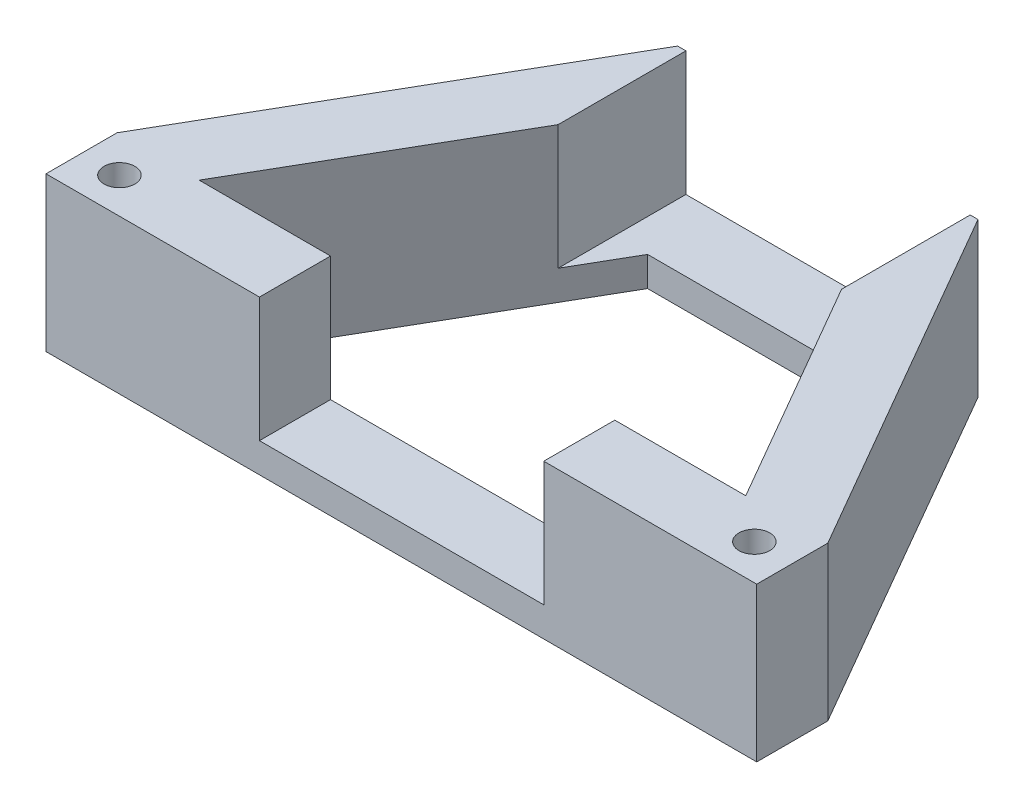
ISO-10303-21;
HEADER;
FILE_DESCRIPTION(('STEP AP214'),'2;1');
FILE_NAME('part.step','',(''),(''),'','','');
FILE_SCHEMA(('AUTOMOTIVE_DESIGN { 1 0 10303 214 1 1 1 1 }'));
ENDSEC;
DATA;
#1=APPLICATION_CONTEXT('core data for automotive mechanical design processes');
#2=APPLICATION_PROTOCOL_DEFINITION('international standard','automotive_design',2000,#1);
#3=PRODUCT_CONTEXT('',#1,'mechanical');
#4=PRODUCT('Part','Part','',(#3));
#5=PRODUCT_RELATED_PRODUCT_CATEGORY('part','',(#4));
#6=PRODUCT_DEFINITION_FORMATION('','',#4);
#7=PRODUCT_DEFINITION_CONTEXT('part definition',#1,'design');
#8=PRODUCT_DEFINITION('design','',#6,#7);
#9=PRODUCT_DEFINITION_SHAPE('','',#8);
#10=(LENGTH_UNIT() NAMED_UNIT(*) SI_UNIT(.MILLI.,.METRE.));
#11=(NAMED_UNIT(*) PLANE_ANGLE_UNIT() SI_UNIT($,.RADIAN.));
#12=(NAMED_UNIT(*) SI_UNIT($,.STERADIAN.) SOLID_ANGLE_UNIT());
#13=UNCERTAINTY_MEASURE_WITH_UNIT(LENGTH_MEASURE(1.E-05),#10,'distance_accuracy_value','');
#14=(GEOMETRIC_REPRESENTATION_CONTEXT(3) GLOBAL_UNCERTAINTY_ASSIGNED_CONTEXT((#13)) GLOBAL_UNIT_ASSIGNED_CONTEXT((#10,
#11,#12)) REPRESENTATION_CONTEXT('',''));
#15=CARTESIAN_POINT('',(0.,0.,0.));
#16=DIRECTION('',(0.,0.,1.));
#17=DIRECTION('',(1.,0.,0.));
#18=AXIS2_PLACEMENT_3D('',#15,#16,#17);
#19=CARTESIAN_POINT('',(0.,16.51,0.));
#20=DIRECTION('',(0.,1.,0.));
#21=DIRECTION('',(0.,0.,1.));
#22=AXIS2_PLACEMENT_3D('',#19,#20,#21);
#23=PLANE('',#22);
#24=DIRECTION('',(0.,0.,1.));
#25=VECTOR('',#24,1.);
#26=CARTESIAN_POINT('',(-3.88055357758678,16.51,-30.6106058641939));
#27=LINE('',#26,#25);
#28=CARTESIAN_POINT('',(-3.88055357758678,16.51,-30.6106058641939));
#29=VERTEX_POINT('',#28);
#30=CARTESIAN_POINT('',(-3.88055357758678,16.51,-16.9103990321226));
#31=VERTEX_POINT('',#30);
#32=EDGE_CURVE('E195',#29,#31,#27,.T.);
#33=ORIENTED_EDGE('',*,*,#32,.F.);
#34=DIRECTION('',(-1.,0.,0.));
#35=VECTOR('',#34,1.);
#36=CARTESIAN_POINT('',(-4.76955357758678,16.51,-30.6106058641939));
#37=LINE('',#36,#35);
#38=CARTESIAN_POINT('',(-4.76955357758678,16.51,-30.6106058641939));
#39=VERTEX_POINT('',#38);
#40=EDGE_CURVE('E268',#29,#39,#37,.T.);
#41=ORIENTED_EDGE('',*,*,#40,.T.);
#42=DIRECTION('',(-0.499999999999998,0.,0.86602540378444));
#43=VECTOR('',#42,1.);
#44=CARTESIAN_POINT('',(-26.7665988337114,16.51,7.48939413580611));
#45=LINE('',#44,#43);
#46=CARTESIAN_POINT('',(-26.7665988337114,16.51,7.48939413580611));
#47=VERTEX_POINT('',#46);
#48=EDGE_CURVE('E272',#39,#47,#45,.T.);
#49=ORIENTED_EDGE('',*,*,#48,.T.);
#50=DIRECTION('',(0.,0.,1.));
#51=VECTOR('',#50,1.);
#52=CARTESIAN_POINT('',(-26.7665988337114,16.51,7.48939413580611));
#53=LINE('',#52,#51);
#54=CARTESIAN_POINT('',(-26.7665988337114,16.51,15.1093941358061));
#55=VERTEX_POINT('',#54);
#56=EDGE_CURVE('E257',#47,#55,#53,.T.);
#57=ORIENTED_EDGE('',*,*,#56,.T.);
#58=DIRECTION('',(1.,0.,0.));
#59=VECTOR('',#58,1.);
#60=CARTESIAN_POINT('',(-26.7665988337114,16.51,15.1093941358061));
#61=LINE('',#60,#59);
#62=CARTESIAN_POINT('',(-3.88055357758678,16.51,15.1093941358061));
#63=VERTEX_POINT('',#62);
#64=EDGE_CURVE('E262',#55,#63,#61,.T.);
#65=ORIENTED_EDGE('',*,*,#64,.T.);
#66=CARTESIAN_POINT('',(-3.88055357758678,16.51,7.48939413580611));
#67=VERTEX_POINT('',#66);
#68=EDGE_CURVE('E181',#67,#63,#27,.T.);
#69=ORIENTED_EDGE('',*,*,#68,.F.);
#70=DIRECTION('',(1.,0.,0.));
#71=VECTOR('',#70,1.);
#72=CARTESIAN_POINT('',(-17.9677807312615,16.51,7.48939413580611));
#73=LINE('',#72,#71);
#74=CARTESIAN_POINT('',(-17.9677807312615,16.51,7.48939413580611));
#75=VERTEX_POINT('',#74);
#76=EDGE_CURVE('E231',#75,#67,#73,.T.);
#77=ORIENTED_EDGE('',*,*,#76,.F.);
#78=DIRECTION('',(-0.499999999999998,0.,0.86602540378444));
#79=VECTOR('',#78,1.);
#80=CARTESIAN_POINT('',(-17.9677807312615,16.51,7.48939413580611));
#81=LINE('',#80,#79);
#82=EDGE_CURVE('E227',#31,#75,#81,.T.);
#83=ORIENTED_EDGE('',*,*,#82,.F.);
#84=EDGE_LOOP('',(#33,#41,#49,#57,#65,#69,#77,#83));
#85=FACE_BOUND('',#84,.T.);
#86=CARTESIAN_POINT('',(-22.7025988337114,16.51,11.2993941358061));
#87=DIRECTION('',(0.,1.,0.));
#88=DIRECTION('',(0.,0.,1.));
#89=AXIS2_PLACEMENT_3D('',#86,#87,#88);
#90=CIRCLE('',#89,1.651);
#91=CARTESIAN_POINT('',(-22.7025988337114,16.51,12.9503941358061));
#92=VERTEX_POINT('',#91);
#93=EDGE_CURVE('E219',#92,#92,#90,.T.);
#94=ORIENTED_EDGE('',*,*,#93,.F.);
#95=EDGE_LOOP('',(#94));
#96=FACE_BOUND('',#95,.T.);
#97=ADVANCED_FACE('F41',(#85,#96),#23,.T.);
#98=CARTESIAN_POINT('',(-0.370144526361818,16.51,-22.9906058641939));
#99=DIRECTION('',(0.,0.,1.));
#100=DIRECTION('',(1.,0.,0.));
#101=AXIS2_PLACEMENT_3D('',#98,#99,#100);
#102=PLANE('',#101);
#103=DIRECTION('',(0.,-1.,0.));
#104=VECTOR('',#103,1.);
#105=CARTESIAN_POINT('',(23.036946858939,16.51,-22.9906058641939));
#106=LINE('',#105,#104);
#107=CARTESIAN_POINT('',(23.036946858939,3.175,-22.9906058641939));
#108=VERTEX_POINT('',#107);
#109=CARTESIAN_POINT('',(23.036946858939,0.,-22.9906058641939));
#110=VERTEX_POINT('',#109);
#111=EDGE_CURVE('E249',#108,#110,#106,.T.);
#112=ORIENTED_EDGE('',*,*,#111,.F.);
#113=DIRECTION('',(-1.,0.,0.));
#114=VECTOR('',#113,1.);
#115=CARTESIAN_POINT('',(-0.370144526361818,3.175,-22.9906058641939));
#116=LINE('',#115,#114);
#117=CARTESIAN_POINT('',(-0.370144526361818,3.175,-22.9906058641939));
#118=VERTEX_POINT('',#117);
#119=EDGE_CURVE('E303',#108,#118,#116,.T.);
#120=ORIENTED_EDGE('',*,*,#119,.T.);
#121=DIRECTION('',(0.,-1.,0.));
#122=VECTOR('',#121,1.);
#123=CARTESIAN_POINT('',(-0.370144526361818,16.51,-22.9906058641939));
#124=LINE('',#123,#122);
#125=CARTESIAN_POINT('',(-0.370144526361818,0.,-22.9906058641939));
#126=VERTEX_POINT('',#125);
#127=EDGE_CURVE('E237',#118,#126,#124,.T.);
#128=ORIENTED_EDGE('',*,*,#127,.T.);
#129=DIRECTION('',(-1.,0.,0.));
#130=VECTOR('',#129,1.);
#131=CARTESIAN_POINT('',(-0.370144526361818,0.,-22.9906058641939));
#132=LINE('',#131,#130);
#133=EDGE_CURVE('E230',#110,#126,#132,.T.);
#134=ORIENTED_EDGE('',*,*,#133,.F.);
#135=EDGE_LOOP('',(#112,#120,#128,#134));
#136=FACE_BOUND('',#135,.T.);
#137=ADVANCED_FACE('F347',(#136),#102,.T.);
#138=DIRECTION('',(0.,0.,-1.));
#139=VECTOR('',#138,1.);
#140=CARTESIAN_POINT('',(26.5994464224132,16.51,-30.6106058641939));
#141=LINE('',#140,#139);
#142=CARTESIAN_POINT('',(26.5994464224132,16.51,15.1093941358061));
#143=VERTEX_POINT('',#142);
#144=CARTESIAN_POINT('',(26.5994464224132,16.51,7.48939413580611));
#145=VERTEX_POINT('',#144);
#146=EDGE_CURVE('E175',#143,#145,#141,.T.);
#147=ORIENTED_EDGE('',*,*,#146,.F.);
#148=CARTESIAN_POINT('',(49.4334011662886,16.51,15.1093941358061));
#149=VERTEX_POINT('',#148);
#150=EDGE_CURVE('E260',#143,#149,#61,.T.);
#151=ORIENTED_EDGE('',*,*,#150,.T.);
#152=DIRECTION('',(0.,0.,-1.));
#153=VECTOR('',#152,1.);
#154=CARTESIAN_POINT('',(49.4334011662887,16.51,7.489394135806));
#155=LINE('',#154,#153);
#156=CARTESIAN_POINT('',(49.4334011662887,16.51,7.489394135806));
#157=VERTEX_POINT('',#156);
#158=EDGE_CURVE('E264',#149,#157,#155,.T.);
#159=ORIENTED_EDGE('',*,*,#158,.T.);
#160=DIRECTION('',(-0.5,0.,-0.866025403784439));
#161=VECTOR('',#160,1.);
#162=CARTESIAN_POINT('',(27.436355910164,16.51,-30.6106058641939));
#163=LINE('',#162,#161);
#164=CARTESIAN_POINT('',(27.436355910164,16.51,-30.6106058641939));
#165=VERTEX_POINT('',#164);
#166=EDGE_CURVE('E266',#157,#165,#163,.T.);
#167=ORIENTED_EDGE('',*,*,#166,.T.);
#168=CARTESIAN_POINT('',(26.5994464224132,16.51,-30.6106058641939));
#169=VERTEX_POINT('',#168);
#170=EDGE_CURVE('E269',#165,#169,#37,.T.);
#171=ORIENTED_EDGE('',*,*,#170,.T.);
#172=CARTESIAN_POINT('',(26.5994464224132,16.51,-16.8201756183146));
#173=VERTEX_POINT('',#172);
#174=EDGE_CURVE('E197',#173,#169,#141,.T.);
#175=ORIENTED_EDGE('',*,*,#174,.F.);
#176=DIRECTION('',(-0.499999999999998,0.,-0.86602540378444));
#177=VECTOR('',#176,1.);
#178=CARTESIAN_POINT('',(23.036946858939,16.51,-22.9906058641939));
#179=LINE('',#178,#177);
#180=CARTESIAN_POINT('',(40.6345830638387,16.51,7.48939413580611));
#181=VERTEX_POINT('',#180);
#182=EDGE_CURVE('E234',#181,#173,#179,.T.);
#183=ORIENTED_EDGE('',*,*,#182,.F.);
#184=EDGE_CURVE('E229',#145,#181,#73,.T.);
#185=ORIENTED_EDGE('',*,*,#184,.F.);
#186=EDGE_LOOP('',(#147,#151,#159,#167,#171,#175,#183,#185));
#187=FACE_BOUND('',#186,.T.);
#188=CARTESIAN_POINT('',(45.3694011662886,16.51,11.2993941358061));
#189=DIRECTION('',(0.,1.,0.));
#190=DIRECTION('',(0.,0.,1.));
#191=AXIS2_PLACEMENT_3D('',#188,#189,#190);
#192=CIRCLE('',#191,1.651);
#193=CARTESIAN_POINT('',(45.3694011662886,16.51,12.9503941358061));
#194=VERTEX_POINT('',#193);
#195=EDGE_CURVE('E222',#194,#194,#192,.T.);
#196=ORIENTED_EDGE('',*,*,#195,.F.);
#197=EDGE_LOOP('',(#196));
#198=FACE_BOUND('',#197,.T.);
#199=ADVANCED_FACE('F314',(#187,#198),#23,.T.);
#200=CARTESIAN_POINT('',(0.,0.,0.));
#201=DIRECTION('',(0.,1.,0.));
#202=DIRECTION('',(0.,0.,1.));
#203=AXIS2_PLACEMENT_3D('',#200,#201,#202);
#204=PLANE('',#203);
#205=CARTESIAN_POINT('',(-22.7025988337114,0.,11.2993941358061));
#206=DIRECTION('',(0.,1.,0.));
#207=DIRECTION('',(0.,0.,1.));
#208=AXIS2_PLACEMENT_3D('',#205,#206,#207);
#209=CIRCLE('',#208,1.651);
#210=CARTESIAN_POINT('',(-22.7025988337114,0.,12.9503941358061));
#211=VERTEX_POINT('',#210);
#212=EDGE_CURVE('E215',#211,#211,#209,.T.);
#213=ORIENTED_EDGE('',*,*,#212,.T.);
#214=EDGE_LOOP('',(#213));
#215=FACE_BOUND('',#214,.T.);
#216=CARTESIAN_POINT('',(45.3694011662886,0.,11.2993941358061));
#217=DIRECTION('',(0.,1.,0.));
#218=DIRECTION('',(0.,0.,1.));
#219=AXIS2_PLACEMENT_3D('',#216,#217,#218);
#220=CIRCLE('',#219,1.651);
#221=CARTESIAN_POINT('',(45.3694011662886,0.,12.9503941358061));
#222=VERTEX_POINT('',#221);
#223=EDGE_CURVE('E214',#222,#222,#220,.T.);
#224=ORIENTED_EDGE('',*,*,#223,.T.);
#225=EDGE_LOOP('',(#224));
#226=FACE_BOUND('',#225,.T.);
#227=DIRECTION('',(0.,0.,1.));
#228=VECTOR('',#227,1.);
#229=CARTESIAN_POINT('',(-26.7665988337114,0.,7.48939413580611));
#230=LINE('',#229,#228);
#231=CARTESIAN_POINT('',(-26.7665988337114,0.,7.48939413580611));
#232=VERTEX_POINT('',#231);
#233=CARTESIAN_POINT('',(-26.7665988337114,0.,15.1093941358061));
#234=VERTEX_POINT('',#233);
#235=EDGE_CURVE('E256',#232,#234,#230,.T.);
#236=ORIENTED_EDGE('',*,*,#235,.F.);
#237=DIRECTION('',(-0.499999999999998,0.,0.86602540378444));
#238=VECTOR('',#237,1.);
#239=CARTESIAN_POINT('',(-26.7665988337114,0.,7.48939413580611));
#240=LINE('',#239,#238);
#241=CARTESIAN_POINT('',(-4.76955357758678,0.,-30.6106058641939));
#242=VERTEX_POINT('',#241);
#243=EDGE_CURVE('E261',#242,#232,#240,.T.);
#244=ORIENTED_EDGE('',*,*,#243,.F.);
#245=DIRECTION('',(-1.,0.,0.));
#246=VECTOR('',#245,1.);
#247=CARTESIAN_POINT('',(-4.76955357758678,0.,-30.6106058641939));
#248=LINE('',#247,#246);
#249=CARTESIAN_POINT('',(27.436355910164,0.,-30.6106058641939));
#250=VERTEX_POINT('',#249);
#251=EDGE_CURVE('E283',#250,#242,#248,.T.);
#252=ORIENTED_EDGE('',*,*,#251,.F.);
#253=DIRECTION('',(-0.5,0.,-0.866025403784439));
#254=VECTOR('',#253,1.);
#255=CARTESIAN_POINT('',(27.436355910164,0.,-30.6106058641939));
#256=LINE('',#255,#254);
#257=CARTESIAN_POINT('',(49.4334011662887,0.,7.489394135806));
#258=VERTEX_POINT('',#257);
#259=EDGE_CURVE('E281',#258,#250,#256,.T.);
#260=ORIENTED_EDGE('',*,*,#259,.F.);
#261=DIRECTION('',(0.,0.,-1.));
#262=VECTOR('',#261,1.);
#263=CARTESIAN_POINT('',(49.4334011662887,0.,7.489394135806));
#264=LINE('',#263,#262);
#265=CARTESIAN_POINT('',(49.4334011662886,0.,15.1093941358061));
#266=VERTEX_POINT('',#265);
#267=EDGE_CURVE('E279',#266,#258,#264,.T.);
#268=ORIENTED_EDGE('',*,*,#267,.F.);
#269=DIRECTION('',(1.,0.,0.));
#270=VECTOR('',#269,1.);
#271=CARTESIAN_POINT('',(-26.7665988337114,0.,15.1093941358061));
#272=LINE('',#271,#270);
#273=EDGE_CURVE('E277',#234,#266,#272,.T.);
#274=ORIENTED_EDGE('',*,*,#273,.F.);
#275=EDGE_LOOP('',(#236,#244,#252,#260,#268,#274));
#276=FACE_BOUND('',#275,.T.);
#277=DIRECTION('',(-0.499999999999998,0.,0.86602540378444));
#278=VECTOR('',#277,1.);
#279=CARTESIAN_POINT('',(-17.9677807312615,0.,7.48939413580611));
#280=LINE('',#279,#278);
#281=CARTESIAN_POINT('',(-17.9677807312615,0.,7.48939413580611));
#282=VERTEX_POINT('',#281);
#283=EDGE_CURVE('E218',#126,#282,#280,.T.);
#284=ORIENTED_EDGE('',*,*,#283,.T.);
#285=DIRECTION('',(1.,0.,0.));
#286=VECTOR('',#285,1.);
#287=CARTESIAN_POINT('',(-17.9677807312615,0.,7.48939413580611));
#288=LINE('',#287,#286);
#289=CARTESIAN_POINT('',(40.6345830638387,0.,7.48939413580611));
#290=VERTEX_POINT('',#289);
#291=EDGE_CURVE('E240',#282,#290,#288,.T.);
#292=ORIENTED_EDGE('',*,*,#291,.T.);
#293=DIRECTION('',(-0.499999999999998,0.,-0.86602540378444));
#294=VECTOR('',#293,1.);
#295=CARTESIAN_POINT('',(23.036946858939,0.,-22.9906058641939));
#296=LINE('',#295,#294);
#297=EDGE_CURVE('E243',#290,#110,#296,.T.);
#298=ORIENTED_EDGE('',*,*,#297,.T.);
#299=ORIENTED_EDGE('',*,*,#133,.T.);
#300=EDGE_LOOP('',(#284,#292,#298,#299));
#301=FACE_BOUND('',#300,.T.);
#302=ADVANCED_FACE('F351',(#215,#226,#276,#301),#204,.F.);
#303=CARTESIAN_POINT('',(-26.7665988337114,16.51,7.48939413580611));
#304=DIRECTION('',(1.,0.,0.));
#305=DIRECTION('',(0.,0.,-1.));
#306=AXIS2_PLACEMENT_3D('',#303,#304,#305);
#307=PLANE('',#306);
#308=ORIENTED_EDGE('',*,*,#235,.T.);
#309=DIRECTION('',(0.,-1.,0.));
#310=VECTOR('',#309,1.);
#311=CARTESIAN_POINT('',(-26.7665988337114,16.51,15.1093941358061));
#312=LINE('',#311,#310);
#313=EDGE_CURVE('E300',#55,#234,#312,.T.);
#314=ORIENTED_EDGE('',*,*,#313,.F.);
#315=ORIENTED_EDGE('',*,*,#56,.F.);
#316=DIRECTION('',(0.,-1.,0.));
#317=VECTOR('',#316,1.);
#318=CARTESIAN_POINT('',(-26.7665988337114,16.51,7.48939413580611));
#319=LINE('',#318,#317);
#320=EDGE_CURVE('E274',#47,#232,#319,.T.);
#321=ORIENTED_EDGE('',*,*,#320,.T.);
#322=EDGE_LOOP('',(#308,#314,#315,#321));
#323=FACE_BOUND('',#322,.T.);
#324=ADVANCED_FACE('F43',(#323),#307,.F.);
#325=CARTESIAN_POINT('',(-26.7665988337114,16.51,15.1093941358061));
#326=DIRECTION('',(0.,0.,-1.));
#327=DIRECTION('',(-1.,0.,0.));
#328=AXIS2_PLACEMENT_3D('',#325,#326,#327);
#329=PLANE('',#328);
#330=DIRECTION('',(1.,0.,0.));
#331=VECTOR('',#330,1.);
#332=CARTESIAN_POINT('',(-3.88055357758678,3.175,15.1093941358061));
#333=LINE('',#332,#331);
#334=CARTESIAN_POINT('',(-3.88055357758678,3.175,15.1093941358061));
#335=VERTEX_POINT('',#334);
#336=CARTESIAN_POINT('',(26.5994464224132,3.175,15.1093941358061));
#337=VERTEX_POINT('',#336);
#338=EDGE_CURVE('E168',#335,#337,#333,.T.);
#339=ORIENTED_EDGE('',*,*,#338,.F.);
#340=DIRECTION('',(0.,1.,0.));
#341=VECTOR('',#340,1.);
#342=CARTESIAN_POINT('',(-3.88055357758678,3.175,15.1093941358061));
#343=LINE('',#342,#341);
#344=EDGE_CURVE('E178',#335,#63,#343,.T.);
#345=ORIENTED_EDGE('',*,*,#344,.T.);
#346=ORIENTED_EDGE('',*,*,#64,.F.);
#347=ORIENTED_EDGE('',*,*,#313,.T.);
#348=ORIENTED_EDGE('',*,*,#273,.T.);
#349=DIRECTION('',(0.,-1.,0.));
#350=VECTOR('',#349,1.);
#351=CARTESIAN_POINT('',(49.4334011662886,16.51,15.1093941358061));
#352=LINE('',#351,#350);
#353=EDGE_CURVE('E297',#149,#266,#352,.T.);
#354=ORIENTED_EDGE('',*,*,#353,.F.);
#355=ORIENTED_EDGE('',*,*,#150,.F.);
#356=DIRECTION('',(0.,1.,0.));
#357=VECTOR('',#356,1.);
#358=CARTESIAN_POINT('',(26.5994464224132,3.175,15.1093941358061));
#359=LINE('',#358,#357);
#360=EDGE_CURVE('E184',#337,#143,#359,.T.);
#361=ORIENTED_EDGE('',*,*,#360,.F.);
#362=EDGE_LOOP('',(#339,#345,#346,#347,#348,#354,#355,#361));
#363=FACE_BOUND('',#362,.T.);
#364=ADVANCED_FACE('F187',(#363),#329,.F.);
#365=CARTESIAN_POINT('',(49.4334011662887,16.51,7.489394135806));
#366=DIRECTION('',(-1.,0.,0.));
#367=DIRECTION('',(0.,0.,1.));
#368=AXIS2_PLACEMENT_3D('',#365,#366,#367);
#369=PLANE('',#368);
#370=ORIENTED_EDGE('',*,*,#267,.T.);
#371=DIRECTION('',(0.,-1.,0.));
#372=VECTOR('',#371,1.);
#373=CARTESIAN_POINT('',(49.4334011662887,16.51,7.489394135806));
#374=LINE('',#373,#372);
#375=EDGE_CURVE('E294',#157,#258,#374,.T.);
#376=ORIENTED_EDGE('',*,*,#375,.F.);
#377=ORIENTED_EDGE('',*,*,#158,.F.);
#378=ORIENTED_EDGE('',*,*,#353,.T.);
#379=EDGE_LOOP('',(#370,#376,#377,#378));
#380=FACE_BOUND('',#379,.T.);
#381=ADVANCED_FACE('F331',(#380),#369,.F.);
#382=CARTESIAN_POINT('',(27.436355910164,16.51,-30.6106058641939));
#383=DIRECTION('',(-0.866025403784439,0.,0.5));
#384=DIRECTION('',(0.5,0.,0.866025403784439));
#385=AXIS2_PLACEMENT_3D('',#382,#383,#384);
#386=PLANE('',#385);
#387=ORIENTED_EDGE('',*,*,#259,.T.);
#388=DIRECTION('',(0.,-1.,0.));
#389=VECTOR('',#388,1.);
#390=CARTESIAN_POINT('',(27.436355910164,16.51,-30.6106058641939));
#391=LINE('',#390,#389);
#392=EDGE_CURVE('E291',#165,#250,#391,.T.);
#393=ORIENTED_EDGE('',*,*,#392,.F.);
#394=ORIENTED_EDGE('',*,*,#166,.F.);
#395=ORIENTED_EDGE('',*,*,#375,.T.);
#396=EDGE_LOOP('',(#387,#393,#394,#395));
#397=FACE_BOUND('',#396,.T.);
#398=ADVANCED_FACE('F335',(#397),#386,.F.);
#399=CARTESIAN_POINT('',(-4.76955357758678,16.51,-30.6106058641939));
#400=DIRECTION('',(0.,0.,1.));
#401=DIRECTION('',(1.,0.,0.));
#402=AXIS2_PLACEMENT_3D('',#399,#400,#401);
#403=PLANE('',#402);
#404=ORIENTED_EDGE('',*,*,#40,.F.);
#405=DIRECTION('',(0.,1.,0.));
#406=VECTOR('',#405,1.);
#407=CARTESIAN_POINT('',(-3.88055357758678,3.175,-30.6106058641939));
#408=LINE('',#407,#406);
#409=CARTESIAN_POINT('',(-3.88055357758678,3.175,-30.6106058641939));
#410=VERTEX_POINT('',#409);
#411=EDGE_CURVE('E199',#410,#29,#408,.T.);
#412=ORIENTED_EDGE('',*,*,#411,.F.);
#413=DIRECTION('',(-1.,0.,0.));
#414=VECTOR('',#413,1.);
#415=CARTESIAN_POINT('',(-3.88055357758678,3.175,-30.6106058641939));
#416=LINE('',#415,#414);
#417=CARTESIAN_POINT('',(26.5994464224132,3.175,-30.6106058641939));
#418=VERTEX_POINT('',#417);
#419=EDGE_CURVE('E185',#418,#410,#416,.T.);
#420=ORIENTED_EDGE('',*,*,#419,.F.);
#421=DIRECTION('',(0.,1.,0.));
#422=VECTOR('',#421,1.);
#423=CARTESIAN_POINT('',(26.5994464224132,3.175,-30.6106058641939));
#424=LINE('',#423,#422);
#425=EDGE_CURVE('E202',#418,#169,#424,.T.);
#426=ORIENTED_EDGE('',*,*,#425,.T.);
#427=ORIENTED_EDGE('',*,*,#170,.F.);
#428=ORIENTED_EDGE('',*,*,#392,.T.);
#429=ORIENTED_EDGE('',*,*,#251,.T.);
#430=DIRECTION('',(0.,-1.,0.));
#431=VECTOR('',#430,1.);
#432=CARTESIAN_POINT('',(-4.76955357758678,16.51,-30.6106058641939));
#433=LINE('',#432,#431);
#434=EDGE_CURVE('E288',#39,#242,#433,.T.);
#435=ORIENTED_EDGE('',*,*,#434,.F.);
#436=EDGE_LOOP('',(#404,#412,#420,#426,#427,#428,#429,#435));
#437=FACE_BOUND('',#436,.T.);
#438=ADVANCED_FACE('F340',(#437),#403,.F.);
#439=CARTESIAN_POINT('',(-26.7665988337114,16.51,7.48939413580611));
#440=DIRECTION('',(0.86602540378444,0.,0.499999999999998));
#441=DIRECTION('',(0.499999999999998,0.,-0.86602540378444));
#442=AXIS2_PLACEMENT_3D('',#439,#440,#441);
#443=PLANE('',#442);
#444=ORIENTED_EDGE('',*,*,#243,.T.);
#445=ORIENTED_EDGE('',*,*,#320,.F.);
#446=ORIENTED_EDGE('',*,*,#48,.F.);
#447=ORIENTED_EDGE('',*,*,#434,.T.);
#448=EDGE_LOOP('',(#444,#445,#446,#447));
#449=FACE_BOUND('',#448,.T.);
#450=ADVANCED_FACE('F370',(#449),#443,.F.);
#451=CARTESIAN_POINT('',(-17.9677807312615,16.51,7.48939413580611));
#452=DIRECTION('',(0.86602540378444,0.,0.499999999999998));
#453=DIRECTION('',(0.499999999999998,0.,-0.86602540378444));
#454=AXIS2_PLACEMENT_3D('',#451,#452,#453);
#455=PLANE('',#454);
#456=DIRECTION('',(0.,-1.,0.));
#457=VECTOR('',#456,1.);
#458=CARTESIAN_POINT('',(-3.88055357758678,16.51,-16.9103990321226));
#459=LINE('',#458,#457);
#460=CARTESIAN_POINT('',(-3.88055357758678,3.175,-16.9103990321226));
#461=VERTEX_POINT('',#460);
#462=EDGE_CURVE('E212',#31,#461,#459,.T.);
#463=ORIENTED_EDGE('',*,*,#462,.F.);
#464=ORIENTED_EDGE('',*,*,#82,.T.);
#465=DIRECTION('',(0.,-1.,0.));
#466=VECTOR('',#465,1.);
#467=CARTESIAN_POINT('',(-17.9677807312615,16.51,7.48939413580611));
#468=LINE('',#467,#466);
#469=EDGE_CURVE('E253',#75,#282,#468,.T.);
#470=ORIENTED_EDGE('',*,*,#469,.T.);
#471=ORIENTED_EDGE('',*,*,#283,.F.);
#472=ORIENTED_EDGE('',*,*,#127,.F.);
#473=DIRECTION('',(-0.499999999999998,0.,0.86602540378444));
#474=VECTOR('',#473,1.);
#475=CARTESIAN_POINT('',(-17.9677807312615,3.175,7.48939413580611));
#476=LINE('',#475,#474);
#477=EDGE_CURVE('E64',#118,#461,#476,.T.);
#478=ORIENTED_EDGE('',*,*,#477,.T.);
#479=EDGE_LOOP('',(#463,#464,#470,#471,#472,#478));
#480=FACE_BOUND('',#479,.T.);
#481=ADVANCED_FACE('F354',(#480),#455,.T.);
#482=CARTESIAN_POINT('',(-17.9677807312615,16.51,7.48939413580611));
#483=DIRECTION('',(0.,0.,-1.));
#484=DIRECTION('',(-1.,0.,0.));
#485=AXIS2_PLACEMENT_3D('',#482,#483,#484);
#486=PLANE('',#485);
#487=DIRECTION('',(0.,1.,0.));
#488=VECTOR('',#487,1.);
#489=CARTESIAN_POINT('',(-3.88055357758678,16.51,7.48939413580611));
#490=LINE('',#489,#488);
#491=CARTESIAN_POINT('',(-3.88055357758678,3.175,7.48939413580611));
#492=VERTEX_POINT('',#491);
#493=EDGE_CURVE('E11',#492,#67,#490,.T.);
#494=ORIENTED_EDGE('',*,*,#493,.F.);
#495=DIRECTION('',(1.,0.,0.));
#496=VECTOR('',#495,1.);
#497=CARTESIAN_POINT('',(-17.9677807312615,3.175,7.48939413580611));
#498=LINE('',#497,#496);
#499=CARTESIAN_POINT('',(26.5994464224132,3.175,7.48939413580611));
#500=VERTEX_POINT('',#499);
#501=EDGE_CURVE('E171',#492,#500,#498,.T.);
#502=ORIENTED_EDGE('',*,*,#501,.T.);
#503=DIRECTION('',(0.,-1.,0.));
#504=VECTOR('',#503,1.);
#505=CARTESIAN_POINT('',(26.5994464224132,16.51,7.48939413580611));
#506=LINE('',#505,#504);
#507=EDGE_CURVE('E210',#145,#500,#506,.T.);
#508=ORIENTED_EDGE('',*,*,#507,.F.);
#509=ORIENTED_EDGE('',*,*,#184,.T.);
#510=DIRECTION('',(0.,-1.,0.));
#511=VECTOR('',#510,1.);
#512=CARTESIAN_POINT('',(40.6345830638387,16.51,7.48939413580611));
#513=LINE('',#512,#511);
#514=EDGE_CURVE('E251',#181,#290,#513,.T.);
#515=ORIENTED_EDGE('',*,*,#514,.T.);
#516=ORIENTED_EDGE('',*,*,#291,.F.);
#517=ORIENTED_EDGE('',*,*,#469,.F.);
#518=ORIENTED_EDGE('',*,*,#76,.T.);
#519=EDGE_LOOP('',(#494,#502,#508,#509,#515,#516,#517,#518));
#520=FACE_BOUND('',#519,.T.);
#521=ADVANCED_FACE('F322',(#520),#486,.T.);
#522=CARTESIAN_POINT('',(23.036946858939,16.51,-22.9906058641939));
#523=DIRECTION('',(-0.86602540378444,0.,0.499999999999998));
#524=DIRECTION('',(0.499999999999998,0.,0.86602540378444));
#525=AXIS2_PLACEMENT_3D('',#522,#523,#524);
#526=PLANE('',#525);
#527=DIRECTION('',(0.,1.,0.));
#528=VECTOR('',#527,1.);
#529=CARTESIAN_POINT('',(26.5994464224132,16.51,-16.8201756183146));
#530=LINE('',#529,#528);
#531=CARTESIAN_POINT('',(26.5994464224132,3.175,-16.8201756183146));
#532=VERTEX_POINT('',#531);
#533=EDGE_CURVE('E49',#532,#173,#530,.T.);
#534=ORIENTED_EDGE('',*,*,#533,.F.);
#535=DIRECTION('',(-0.499999999999998,0.,-0.86602540378444));
#536=VECTOR('',#535,1.);
#537=CARTESIAN_POINT('',(23.036946858939,3.175,-22.9906058641939));
#538=LINE('',#537,#536);
#539=EDGE_CURVE('E201',#532,#108,#538,.T.);
#540=ORIENTED_EDGE('',*,*,#539,.T.);
#541=ORIENTED_EDGE('',*,*,#111,.T.);
#542=ORIENTED_EDGE('',*,*,#297,.F.);
#543=ORIENTED_EDGE('',*,*,#514,.F.);
#544=ORIENTED_EDGE('',*,*,#182,.T.);
#545=EDGE_LOOP('',(#534,#540,#541,#542,#543,#544));
#546=FACE_BOUND('',#545,.T.);
#547=ADVANCED_FACE('F319',(#546),#526,.T.);
#548=CARTESIAN_POINT('',(45.3694011662886,0.,11.2993941358061));
#549=DIRECTION('',(0.,1.,0.));
#550=DIRECTION('',(0.,0.,1.));
#551=AXIS2_PLACEMENT_3D('',#548,#549,#550);
#552=CYLINDRICAL_SURFACE('',#551,1.651);
#553=ORIENTED_EDGE('',*,*,#223,.F.);
#554=EDGE_LOOP('',(#553));
#555=FACE_BOUND('',#554,.T.);
#556=ORIENTED_EDGE('',*,*,#195,.T.);
#557=EDGE_LOOP('',(#556));
#558=FACE_BOUND('',#557,.T.);
#559=ADVANCED_FACE('F442',(#555,#558),#552,.F.);
#560=CARTESIAN_POINT('',(-22.7025988337114,0.,11.2993941358061));
#561=DIRECTION('',(0.,1.,0.));
#562=DIRECTION('',(0.,0.,1.));
#563=AXIS2_PLACEMENT_3D('',#560,#561,#562);
#564=CYLINDRICAL_SURFACE('',#563,1.651);
#565=ORIENTED_EDGE('',*,*,#212,.F.);
#566=EDGE_LOOP('',(#565));
#567=FACE_BOUND('',#566,.T.);
#568=ORIENTED_EDGE('',*,*,#93,.T.);
#569=EDGE_LOOP('',(#568));
#570=FACE_BOUND('',#569,.T.);
#571=ADVANCED_FACE('F450',(#567,#570),#564,.F.);
#572=CARTESIAN_POINT('',(0.,3.175,0.));
#573=DIRECTION('',(0.,1.,0.));
#574=DIRECTION('',(0.,0.,1.));
#575=AXIS2_PLACEMENT_3D('',#572,#573,#574);
#576=PLANE('',#575);
#577=ORIENTED_EDGE('',*,*,#119,.F.);
#578=ORIENTED_EDGE('',*,*,#539,.F.);
#579=DIRECTION('',(0.,0.,-1.));
#580=VECTOR('',#579,1.);
#581=CARTESIAN_POINT('',(26.5994464224132,3.175,-30.6106058641939));
#582=LINE('',#581,#580);
#583=EDGE_CURVE('E189',#532,#418,#582,.T.);
#584=ORIENTED_EDGE('',*,*,#583,.T.);
#585=ORIENTED_EDGE('',*,*,#419,.T.);
#586=DIRECTION('',(0.,0.,1.));
#587=VECTOR('',#586,1.);
#588=CARTESIAN_POINT('',(-3.88055357758678,3.175,-30.6106058641939));
#589=LINE('',#588,#587);
#590=EDGE_CURVE('E174',#410,#461,#589,.T.);
#591=ORIENTED_EDGE('',*,*,#590,.T.);
#592=ORIENTED_EDGE('',*,*,#477,.F.);
#593=EDGE_LOOP('',(#577,#578,#584,#585,#591,#592));
#594=FACE_BOUND('',#593,.T.);
#595=ADVANCED_FACE('F343',(#594),#576,.T.);
#596=CARTESIAN_POINT('',(26.5994464224132,3.175,-30.6106058641939));
#597=DIRECTION('',(1.,0.,0.));
#598=DIRECTION('',(0.,0.,-1.));
#599=AXIS2_PLACEMENT_3D('',#596,#597,#598);
#600=PLANE('',#599);
#601=ORIENTED_EDGE('',*,*,#533,.T.);
#602=ORIENTED_EDGE('',*,*,#174,.T.);
#603=ORIENTED_EDGE('',*,*,#425,.F.);
#604=ORIENTED_EDGE('',*,*,#583,.F.);
#605=EDGE_LOOP('',(#601,#602,#603,#604));
#606=FACE_BOUND('',#605,.T.);
#607=ADVANCED_FACE('F308',(#606),#600,.F.);
#608=CARTESIAN_POINT('',(-3.88055357758678,3.175,-30.6106058641939));
#609=DIRECTION('',(-1.,0.,0.));
#610=DIRECTION('',(0.,0.,1.));
#611=AXIS2_PLACEMENT_3D('',#608,#609,#610);
#612=PLANE('',#611);
#613=ORIENTED_EDGE('',*,*,#462,.T.);
#614=ORIENTED_EDGE('',*,*,#590,.F.);
#615=ORIENTED_EDGE('',*,*,#411,.T.);
#616=ORIENTED_EDGE('',*,*,#32,.T.);
#617=EDGE_LOOP('',(#613,#614,#615,#616));
#618=FACE_BOUND('',#617,.T.);
#619=ADVANCED_FACE('F372',(#618),#612,.F.);
#620=ORIENTED_EDGE('',*,*,#507,.T.);
#621=EDGE_CURVE('E56',#337,#500,#582,.T.);
#622=ORIENTED_EDGE('',*,*,#621,.F.);
#623=ORIENTED_EDGE('',*,*,#360,.T.);
#624=ORIENTED_EDGE('',*,*,#146,.T.);
#625=EDGE_LOOP('',(#620,#622,#623,#624));
#626=FACE_BOUND('',#625,.T.);
#627=ADVANCED_FACE('F374',(#626),#600,.F.);
#628=EDGE_CURVE('E164',#492,#335,#589,.T.);
#629=ORIENTED_EDGE('',*,*,#628,.T.);
#630=ORIENTED_EDGE('',*,*,#338,.T.);
#631=ORIENTED_EDGE('',*,*,#621,.T.);
#632=ORIENTED_EDGE('',*,*,#501,.F.);
#633=EDGE_LOOP('',(#629,#630,#631,#632));
#634=FACE_BOUND('',#633,.T.);
#635=ADVANCED_FACE('F166',(#634),#576,.T.);
#636=ORIENTED_EDGE('',*,*,#493,.T.);
#637=ORIENTED_EDGE('',*,*,#68,.T.);
#638=ORIENTED_EDGE('',*,*,#344,.F.);
#639=ORIENTED_EDGE('',*,*,#628,.F.);
#640=EDGE_LOOP('',(#636,#637,#638,#639));
#641=FACE_BOUND('',#640,.T.);
#642=ADVANCED_FACE('F179',(#641),#612,.F.);
#643=CLOSED_SHELL('',(#97,#137,#199,#302,#324,#364,#381,#398,#438,#450,#481,#521,#547,#559,#571,
#595,#607,#619,#627,#635,#642));
#644=MANIFOLD_SOLID_BREP('B2',#643);
#645=ADVANCED_BREP_SHAPE_REPRESENTATION('',(#18,#644),#14);
#646=SHAPE_DEFINITION_REPRESENTATION(#9,#645);
ENDSEC;
END-ISO-10303-21;
